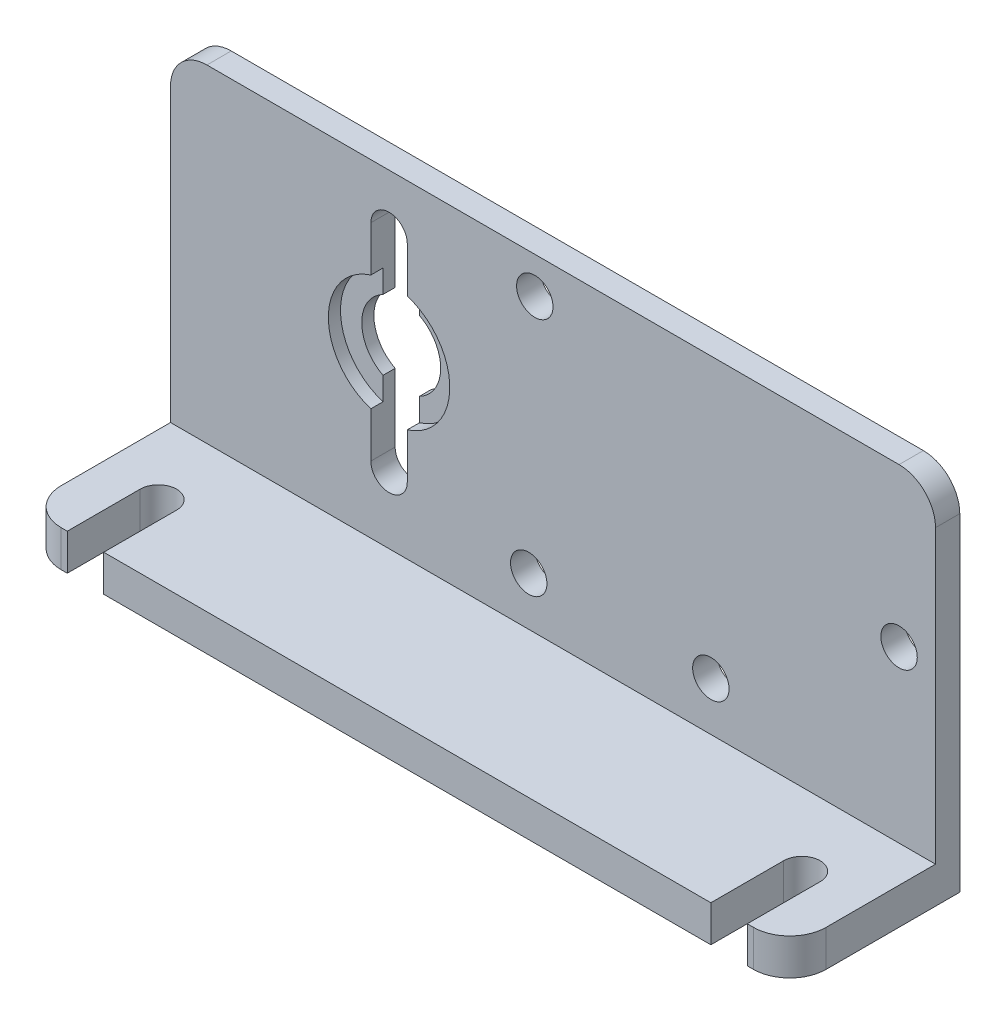
ISO-10303-21;
HEADER;
FILE_DESCRIPTION(('STEP AP214'),'2;1');
FILE_NAME('part.step','',(''),(''),'','','');
FILE_SCHEMA(('AUTOMOTIVE_DESIGN { 1 0 10303 214 1 1 1 1 }'));
ENDSEC;
DATA;
#1=APPLICATION_CONTEXT('core data for automotive mechanical design processes');
#2=APPLICATION_PROTOCOL_DEFINITION('international standard','automotive_design',2000,#1);
#3=PRODUCT_CONTEXT('',#1,'mechanical');
#4=PRODUCT('Part','Part','',(#3));
#5=PRODUCT_RELATED_PRODUCT_CATEGORY('part','',(#4));
#6=PRODUCT_DEFINITION_FORMATION('','',#4);
#7=PRODUCT_DEFINITION_CONTEXT('part definition',#1,'design');
#8=PRODUCT_DEFINITION('design','',#6,#7);
#9=PRODUCT_DEFINITION_SHAPE('','',#8);
#10=(LENGTH_UNIT() NAMED_UNIT(*) SI_UNIT(.MILLI.,.METRE.));
#11=(NAMED_UNIT(*) PLANE_ANGLE_UNIT() SI_UNIT($,.RADIAN.));
#12=(NAMED_UNIT(*) SI_UNIT($,.STERADIAN.) SOLID_ANGLE_UNIT());
#13=UNCERTAINTY_MEASURE_WITH_UNIT(LENGTH_MEASURE(1.E-05),#10,'distance_accuracy_value','');
#14=(GEOMETRIC_REPRESENTATION_CONTEXT(3) GLOBAL_UNCERTAINTY_ASSIGNED_CONTEXT((#13)) GLOBAL_UNIT_ASSIGNED_CONTEXT((#10,
#11,#12)) REPRESENTATION_CONTEXT('',''));
#15=CARTESIAN_POINT('',(0.,0.,0.));
#16=DIRECTION('',(0.,0.,1.));
#17=DIRECTION('',(1.,0.,0.));
#18=AXIS2_PLACEMENT_3D('',#15,#16,#17);
#19=CARTESIAN_POINT('',(-12.,10.5,0.));
#20=DIRECTION('',(1.,0.,0.));
#21=DIRECTION('',(0.,1.,0.));
#22=AXIS2_PLACEMENT_3D('',#19,#20,#21);
#23=PLANE('',#22);
#24=DIRECTION('',(0.,1.,0.));
#25=VECTOR('',#24,1.);
#26=CARTESIAN_POINT('',(-12.,10.5,0.));
#27=LINE('',#26,#25);
#28=CARTESIAN_POINT('',(-12.,4.88314064866771,0.));
#29=VERTEX_POINT('',#28);
#30=CARTESIAN_POINT('',(-12.,10.5,0.));
#31=VERTEX_POINT('',#30);
#32=EDGE_CURVE('E253',#29,#31,#27,.T.);
#33=ORIENTED_EDGE('',*,*,#32,.F.);
#34=DIRECTION('',(0.,0.,1.));
#35=VECTOR('',#34,1.);
#36=CARTESIAN_POINT('',(-12.,4.88314064866771,0.));
#37=LINE('',#36,#35);
#38=CARTESIAN_POINT('',(-12.,4.88314064866771,0.999999999999945));
#39=VERTEX_POINT('',#38);
#40=EDGE_CURVE('E237',#29,#39,#37,.T.);
#41=ORIENTED_EDGE('',*,*,#40,.T.);
#42=DIRECTION('',(0.,-1.,0.));
#43=VECTOR('',#42,1.);
#44=CARTESIAN_POINT('',(-12.,10.5,0.999999999999945));
#45=LINE('',#44,#43);
#46=CARTESIAN_POINT('',(-12.,6.76969600708474,0.999999999999945));
#47=VERTEX_POINT('',#46);
#48=EDGE_CURVE('E529',#47,#39,#45,.T.);
#49=ORIENTED_EDGE('',*,*,#48,.F.);
#50=DIRECTION('',(0.,0.,1.));
#51=VECTOR('',#50,1.);
#52=CARTESIAN_POINT('',(-12.,6.76969600708474,0.999999999999945));
#53=LINE('',#52,#51);
#54=CARTESIAN_POINT('',(-12.,6.76969600708474,1.99999999999995));
#55=VERTEX_POINT('',#54);
#56=EDGE_CURVE('E280',#47,#55,#53,.T.);
#57=ORIENTED_EDGE('',*,*,#56,.T.);
#58=DIRECTION('',(0.,1.,0.));
#59=VECTOR('',#58,1.);
#60=CARTESIAN_POINT('',(-12.,10.5,1.99999999999995));
#61=LINE('',#60,#59);
#62=CARTESIAN_POINT('',(-12.,10.5,1.99999999999995));
#63=VERTEX_POINT('',#62);
#64=EDGE_CURVE('E289',#55,#63,#61,.T.);
#65=ORIENTED_EDGE('',*,*,#64,.T.);
#66=DIRECTION('',(0.,0.,1.));
#67=VECTOR('',#66,1.);
#68=CARTESIAN_POINT('',(-12.,10.5,0.));
#69=LINE('',#68,#67);
#70=EDGE_CURVE('E263',#31,#63,#69,.T.);
#71=ORIENTED_EDGE('',*,*,#70,.F.);
#72=EDGE_LOOP('',(#33,#41,#49,#57,#65,#71));
#73=FACE_BOUND('',#72,.T.);
#74=ADVANCED_FACE('F42',(#73),#23,.F.);
#75=CARTESIAN_POINT('',(-15.,10.5,0.));
#76=DIRECTION('',(-1.,0.,0.));
#77=DIRECTION('',(0.,-1.,0.));
#78=AXIS2_PLACEMENT_3D('',#75,#76,#77);
#79=PLANE('',#78);
#80=DIRECTION('',(0.,-1.,0.));
#81=VECTOR('',#80,1.);
#82=CARTESIAN_POINT('',(-15.,10.5,0.));
#83=LINE('',#82,#81);
#84=CARTESIAN_POINT('',(-15.,-0.88314064866768,0.));
#85=VERTEX_POINT('',#84);
#86=CARTESIAN_POINT('',(-15.,-6.49999999999998,0.));
#87=VERTEX_POINT('',#86);
#88=EDGE_CURVE('E610',#85,#87,#83,.T.);
#89=ORIENTED_EDGE('',*,*,#88,.F.);
#90=DIRECTION('',(0.,0.,1.));
#91=VECTOR('',#90,1.);
#92=CARTESIAN_POINT('',(-15.,-0.88314064866768,0.));
#93=LINE('',#92,#91);
#94=CARTESIAN_POINT('',(-15.,-0.88314064866768,0.999999999999945));
#95=VERTEX_POINT('',#94);
#96=EDGE_CURVE('E552',#85,#95,#93,.T.);
#97=ORIENTED_EDGE('',*,*,#96,.T.);
#98=DIRECTION('',(0.,1.,0.));
#99=VECTOR('',#98,1.);
#100=CARTESIAN_POINT('',(-15.,10.5,0.999999999999945));
#101=LINE('',#100,#99);
#102=CARTESIAN_POINT('',(-15.,-2.76969600708471,0.999999999999945));
#103=VERTEX_POINT('',#102);
#104=EDGE_CURVE('E487',#103,#95,#101,.T.);
#105=ORIENTED_EDGE('',*,*,#104,.F.);
#106=DIRECTION('',(0.,0.,1.));
#107=VECTOR('',#106,1.);
#108=CARTESIAN_POINT('',(-15.,-2.76969600708471,0.999999999999945));
#109=LINE('',#108,#107);
#110=CARTESIAN_POINT('',(-15.,-2.76969600708471,1.99999999999995));
#111=VERTEX_POINT('',#110);
#112=EDGE_CURVE('E51',#103,#111,#109,.T.);
#113=ORIENTED_EDGE('',*,*,#112,.T.);
#114=DIRECTION('',(0.,-1.,0.));
#115=VECTOR('',#114,1.);
#116=CARTESIAN_POINT('',(-15.,10.5,1.99999999999995));
#117=LINE('',#116,#115);
#118=CARTESIAN_POINT('',(-15.,-6.49999999999998,1.99999999999995));
#119=VERTEX_POINT('',#118);
#120=EDGE_CURVE('E279',#111,#119,#117,.T.);
#121=ORIENTED_EDGE('',*,*,#120,.T.);
#122=DIRECTION('',(0.,0.,1.));
#123=VECTOR('',#122,1.);
#124=CARTESIAN_POINT('',(-15.,-6.49999999999998,0.));
#125=LINE('',#124,#123);
#126=EDGE_CURVE('E301',#87,#119,#125,.T.);
#127=ORIENTED_EDGE('',*,*,#126,.F.);
#128=EDGE_LOOP('',(#89,#97,#105,#113,#121,#127));
#129=FACE_BOUND('',#128,.T.);
#130=ADVANCED_FACE('F502',(#129),#79,.F.);
#131=CARTESIAN_POINT('',(0.,0.,14.));
#132=DIRECTION('',(0.,0.,-1.));
#133=DIRECTION('',(-1.,0.,0.));
#134=AXIS2_PLACEMENT_3D('',#131,#132,#133);
#135=PLANE('',#134);
#136=DIRECTION('',(1.,0.,0.));
#137=VECTOR('',#136,1.);
#138=CARTESIAN_POINT('',(-31.5,-15.,14.));
#139=LINE('',#138,#137);
#140=CARTESIAN_POINT('',(-25.,-15.,14.));
#141=VERTEX_POINT('',#140);
#142=CARTESIAN_POINT('',(25.,-15.,13.9999999999999));
#143=VERTEX_POINT('',#142);
#144=EDGE_CURVE('E385',#141,#143,#139,.T.);
#145=ORIENTED_EDGE('',*,*,#144,.T.);
#146=DIRECTION('',(0.,1.,0.));
#147=VECTOR('',#146,1.);
#148=CARTESIAN_POINT('',(25.,-15.,13.9999999999999));
#149=LINE('',#148,#147);
#150=CARTESIAN_POINT('',(25.,-12.,13.9999999999999));
#151=VERTEX_POINT('',#150);
#152=EDGE_CURVE('E333',#143,#151,#149,.T.);
#153=ORIENTED_EDGE('',*,*,#152,.T.);
#154=DIRECTION('',(-1.,0.,0.));
#155=VECTOR('',#154,1.);
#156=CARTESIAN_POINT('',(-31.5,-12.,14.));
#157=LINE('',#156,#155);
#158=CARTESIAN_POINT('',(-25.,-12.,14.));
#159=VERTEX_POINT('',#158);
#160=EDGE_CURVE('E391',#151,#159,#157,.T.);
#161=ORIENTED_EDGE('',*,*,#160,.T.);
#162=DIRECTION('',(0.,1.,0.));
#163=VECTOR('',#162,1.);
#164=CARTESIAN_POINT('',(-25.,-15.,14.));
#165=LINE('',#164,#163);
#166=EDGE_CURVE('E360',#141,#159,#165,.T.);
#167=ORIENTED_EDGE('',*,*,#166,.F.);
#168=EDGE_LOOP('',(#145,#153,#161,#167));
#169=FACE_BOUND('',#168,.T.);
#170=ADVANCED_FACE('F779',(#169),#135,.F.);
#171=CARTESIAN_POINT('',(-28.,-12.,14.));
#172=VERTEX_POINT('',#171);
#173=CARTESIAN_POINT('',(-28.5,-12.,14.));
#174=VERTEX_POINT('',#173);
#175=EDGE_CURVE('E384',#172,#174,#157,.T.);
#176=ORIENTED_EDGE('',*,*,#175,.T.);
#177=DIRECTION('',(0.,-1.,0.));
#178=VECTOR('',#177,1.);
#179=CARTESIAN_POINT('',(-28.5,0.,14.));
#180=LINE('',#179,#178);
#181=CARTESIAN_POINT('',(-28.5,-15.,14.));
#182=VERTEX_POINT('',#181);
#183=EDGE_CURVE('E466',#174,#182,#180,.T.);
#184=ORIENTED_EDGE('',*,*,#183,.T.);
#185=CARTESIAN_POINT('',(-28.,-15.,14.));
#186=VERTEX_POINT('',#185);
#187=EDGE_CURVE('E381',#182,#186,#139,.T.);
#188=ORIENTED_EDGE('',*,*,#187,.T.);
#189=DIRECTION('',(0.,1.,0.));
#190=VECTOR('',#189,1.);
#191=CARTESIAN_POINT('',(-28.,-15.,14.));
#192=LINE('',#191,#190);
#193=EDGE_CURVE('E327',#186,#172,#192,.T.);
#194=ORIENTED_EDGE('',*,*,#193,.T.);
#195=EDGE_LOOP('',(#176,#184,#188,#194));
#196=FACE_BOUND('',#195,.T.);
#197=ADVANCED_FACE('F761',(#196),#135,.F.);
#198=CARTESIAN_POINT('',(0.,0.,2.));
#199=DIRECTION('',(0.,0.,-1.));
#200=DIRECTION('',(-1.,0.,0.));
#201=AXIS2_PLACEMENT_3D('',#198,#199,#200);
#202=PLANE('',#201);
#203=CARTESIAN_POINT('',(28.5,2.,2.));
#204=DIRECTION('',(0.,0.,1.));
#205=DIRECTION('',(1.,0.,0.));
#206=AXIS2_PLACEMENT_3D('',#203,#204,#205);
#207=CIRCLE('',#206,1.5);
#208=CARTESIAN_POINT('',(30.,2.,2.));
#209=VERTEX_POINT('',#208);
#210=EDGE_CURVE('E571',#209,#209,#207,.T.);
#211=ORIENTED_EDGE('',*,*,#210,.F.);
#212=EDGE_LOOP('',(#211));
#213=FACE_BOUND('',#212,.T.);
#214=CARTESIAN_POINT('',(-1.5,12.,2.));
#215=DIRECTION('',(0.,0.,1.));
#216=DIRECTION('',(1.,0.,0.));
#217=AXIS2_PLACEMENT_3D('',#214,#215,#216);
#218=CIRCLE('',#217,1.5);
#219=CARTESIAN_POINT('',(0.,12.,2.));
#220=VERTEX_POINT('',#219);
#221=EDGE_CURVE('E581',#220,#220,#218,.T.);
#222=ORIENTED_EDGE('',*,*,#221,.F.);
#223=EDGE_LOOP('',(#222));
#224=FACE_BOUND('',#223,.T.);
#225=CARTESIAN_POINT('',(-2.,-8.00000000000001,2.));
#226=DIRECTION('',(0.,0.,1.));
#227=DIRECTION('',(1.,0.,0.));
#228=AXIS2_PLACEMENT_3D('',#225,#226,#227);
#229=CIRCLE('',#228,1.5);
#230=CARTESIAN_POINT('',(-0.500000000000002,-8.00000000000001,2.));
#231=VERTEX_POINT('',#230);
#232=EDGE_CURVE('E591',#231,#231,#229,.T.);
#233=ORIENTED_EDGE('',*,*,#232,.F.);
#234=EDGE_LOOP('',(#233));
#235=FACE_BOUND('',#234,.T.);
#236=CARTESIAN_POINT('',(13.,-8.00000000000001,1.99999999999999));
#237=DIRECTION('',(0.,0.,1.));
#238=DIRECTION('',(1.,0.,0.));
#239=AXIS2_PLACEMENT_3D('',#236,#237,#238);
#240=CIRCLE('',#239,1.5);
#241=CARTESIAN_POINT('',(14.5,-8.00000000000001,1.99999999999999));
#242=VERTEX_POINT('',#241);
#243=EDGE_CURVE('E601',#242,#242,#240,.T.);
#244=ORIENTED_EDGE('',*,*,#243,.F.);
#245=EDGE_LOOP('',(#244));
#246=FACE_BOUND('',#245,.T.);
#247=ORIENTED_EDGE('',*,*,#64,.F.);
#248=CARTESIAN_POINT('',(-13.5,2.,1.99999999999995));
#249=DIRECTION('',(0.,0.,1.));
#250=DIRECTION('',(1.,0.,0.));
#251=AXIS2_PLACEMENT_3D('',#248,#249,#250);
#252=CIRCLE('',#251,5.);
#253=CARTESIAN_POINT('',(-12.,-2.76969600708471,1.99999999999995));
#254=VERTEX_POINT('',#253);
#255=EDGE_CURVE('E246',#254,#55,#252,.T.);
#256=ORIENTED_EDGE('',*,*,#255,.F.);
#257=CARTESIAN_POINT('',(-12.,-6.49999999999998,1.99999999999995));
#258=VERTEX_POINT('',#257);
#259=EDGE_CURVE('E290',#258,#254,#61,.T.);
#260=ORIENTED_EDGE('',*,*,#259,.F.);
#261=CARTESIAN_POINT('',(-13.5,-6.49999999999998,1.99999999999995));
#262=DIRECTION('',(0.,0.,1.));
#263=DIRECTION('',(1.,0.,0.));
#264=AXIS2_PLACEMENT_3D('',#261,#262,#263);
#265=CIRCLE('',#264,1.5);
#266=EDGE_CURVE('E285',#119,#258,#265,.T.);
#267=ORIENTED_EDGE('',*,*,#266,.F.);
#268=ORIENTED_EDGE('',*,*,#120,.F.);
#269=CARTESIAN_POINT('',(-15.,6.76969600708474,1.99999999999995));
#270=VERTEX_POINT('',#269);
#271=EDGE_CURVE('E514',#270,#111,#252,.T.);
#272=ORIENTED_EDGE('',*,*,#271,.F.);
#273=CARTESIAN_POINT('',(-15.,10.5,1.99999999999995));
#274=VERTEX_POINT('',#273);
#275=EDGE_CURVE('E281',#274,#270,#117,.T.);
#276=ORIENTED_EDGE('',*,*,#275,.F.);
#277=CARTESIAN_POINT('',(-13.5,10.5,1.99999999999995));
#278=DIRECTION('',(0.,0.,1.));
#279=DIRECTION('',(1.,0.,0.));
#280=AXIS2_PLACEMENT_3D('',#277,#278,#279);
#281=CIRCLE('',#280,1.5);
#282=EDGE_CURVE('E276',#63,#274,#281,.T.);
#283=ORIENTED_EDGE('',*,*,#282,.F.);
#284=EDGE_LOOP('',(#247,#256,#260,#267,#268,#272,#276,#283));
#285=FACE_BOUND('',#284,.T.);
#286=DIRECTION('',(-1.,0.,0.));
#287=VECTOR('',#286,1.);
#288=CARTESIAN_POINT('',(31.5,15.,2.));
#289=LINE('',#288,#287);
#290=CARTESIAN_POINT('',(28.5,15.,2.));
#291=VERTEX_POINT('',#290);
#292=CARTESIAN_POINT('',(-28.5,15.,2.));
#293=VERTEX_POINT('',#292);
#294=EDGE_CURVE('E410',#291,#293,#289,.T.);
#295=ORIENTED_EDGE('',*,*,#294,.T.);
#296=CARTESIAN_POINT('',(-28.5,12.,2.));
#297=DIRECTION('',(0.,0.,-1.));
#298=DIRECTION('',(-1.,0.,0.));
#299=AXIS2_PLACEMENT_3D('',#296,#297,#298);
#300=CIRCLE('',#299,3.);
#301=CARTESIAN_POINT('',(-31.5,12.,2.));
#302=VERTEX_POINT('',#301);
#303=EDGE_CURVE('E457',#293,#302,#300,.F.);
#304=ORIENTED_EDGE('',*,*,#303,.T.);
#305=DIRECTION('',(0.,-1.,0.));
#306=VECTOR('',#305,1.);
#307=CARTESIAN_POINT('',(-31.5,15.,2.));
#308=LINE('',#307,#306);
#309=CARTESIAN_POINT('',(-31.5,-12.,2.));
#310=VERTEX_POINT('',#309);
#311=EDGE_CURVE('E402',#302,#310,#308,.T.);
#312=ORIENTED_EDGE('',*,*,#311,.T.);
#313=DIRECTION('',(-1.,0.,0.));
#314=VECTOR('',#313,1.);
#315=CARTESIAN_POINT('',(-31.5,-12.,2.));
#316=LINE('',#315,#314);
#317=CARTESIAN_POINT('',(31.5,-12.,2.));
#318=VERTEX_POINT('',#317);
#319=EDGE_CURVE('E337',#318,#310,#316,.T.);
#320=ORIENTED_EDGE('',*,*,#319,.F.);
#321=DIRECTION('',(0.,1.,0.));
#322=VECTOR('',#321,1.);
#323=CARTESIAN_POINT('',(31.5,15.,2.));
#324=LINE('',#323,#322);
#325=CARTESIAN_POINT('',(31.5,12.,2.));
#326=VERTEX_POINT('',#325);
#327=EDGE_CURVE('E405',#318,#326,#324,.T.);
#328=ORIENTED_EDGE('',*,*,#327,.T.);
#329=CARTESIAN_POINT('',(28.5,12.,2.));
#330=DIRECTION('',(0.,0.,-1.));
#331=DIRECTION('',(-1.,0.,0.));
#332=AXIS2_PLACEMENT_3D('',#329,#330,#331);
#333=CIRCLE('',#332,3.);
#334=EDGE_CURVE('E454',#326,#291,#333,.F.);
#335=ORIENTED_EDGE('',*,*,#334,.T.);
#336=EDGE_LOOP('',(#295,#304,#312,#320,#328,#335));
#337=FACE_BOUND('',#336,.T.);
#338=ADVANCED_FACE('F511',(#213,#224,#235,#246,#285,#337),#202,.F.);
#339=CARTESIAN_POINT('',(-31.5,15.,2.));
#340=DIRECTION('',(1.,0.,0.));
#341=DIRECTION('',(0.,0.,-1.));
#342=AXIS2_PLACEMENT_3D('',#339,#340,#341);
#343=PLANE('',#342);
#344=ORIENTED_EDGE('',*,*,#311,.F.);
#345=DIRECTION('',(0.,0.,-1.));
#346=VECTOR('',#345,1.);
#347=CARTESIAN_POINT('',(-31.5,12.,2.));
#348=LINE('',#347,#346);
#349=CARTESIAN_POINT('',(-31.5,12.,0.));
#350=VERTEX_POINT('',#349);
#351=EDGE_CURVE('E437',#302,#350,#348,.T.);
#352=ORIENTED_EDGE('',*,*,#351,.T.);
#353=DIRECTION('',(0.,-1.,0.));
#354=VECTOR('',#353,1.);
#355=CARTESIAN_POINT('',(-31.5,15.,0.));
#356=LINE('',#355,#354);
#357=CARTESIAN_POINT('',(-31.5,-15.,0.));
#358=VERTEX_POINT('',#357);
#359=EDGE_CURVE('E401',#350,#358,#356,.T.);
#360=ORIENTED_EDGE('',*,*,#359,.T.);
#361=DIRECTION('',(0.,0.,-1.));
#362=VECTOR('',#361,1.);
#363=CARTESIAN_POINT('',(-31.5,-15.,2.));
#364=LINE('',#363,#362);
#365=CARTESIAN_POINT('',(-31.5,-15.,11.));
#366=VERTEX_POINT('',#365);
#367=EDGE_CURVE('E431',#366,#358,#364,.T.);
#368=ORIENTED_EDGE('',*,*,#367,.F.);
#369=DIRECTION('',(0.,-1.,0.));
#370=VECTOR('',#369,1.);
#371=CARTESIAN_POINT('',(-31.5,15.,11.));
#372=LINE('',#371,#370);
#373=CARTESIAN_POINT('',(-31.5,-12.,11.));
#374=VERTEX_POINT('',#373);
#375=EDGE_CURVE('E434',#366,#374,#372,.F.);
#376=ORIENTED_EDGE('',*,*,#375,.T.);
#377=DIRECTION('',(0.,0.,-1.));
#378=VECTOR('',#377,1.);
#379=CARTESIAN_POINT('',(-31.5,-12.,14.));
#380=LINE('',#379,#378);
#381=EDGE_CURVE('E390',#374,#310,#380,.T.);
#382=ORIENTED_EDGE('',*,*,#381,.T.);
#383=EDGE_LOOP('',(#344,#352,#360,#368,#376,#382));
#384=FACE_BOUND('',#383,.T.);
#385=ADVANCED_FACE('F751',(#384),#343,.F.);
#386=CARTESIAN_POINT('',(31.5,-15.,2.));
#387=DIRECTION('',(0.,1.,0.));
#388=DIRECTION('',(-1.,0.,0.));
#389=AXIS2_PLACEMENT_3D('',#386,#387,#388);
#390=PLANE('',#389);
#391=ORIENTED_EDGE('',*,*,#187,.F.);
#392=CARTESIAN_POINT('',(-28.5,-15.,11.));
#393=DIRECTION('',(0.,1.,0.));
#394=DIRECTION('',(-1.,0.,0.));
#395=AXIS2_PLACEMENT_3D('',#392,#393,#394);
#396=CIRCLE('',#395,3.);
#397=EDGE_CURVE('E473',#182,#366,#396,.F.);
#398=ORIENTED_EDGE('',*,*,#397,.T.);
#399=ORIENTED_EDGE('',*,*,#367,.T.);
#400=DIRECTION('',(1.,0.,0.));
#401=VECTOR('',#400,1.);
#402=CARTESIAN_POINT('',(31.5,-15.,0.));
#403=LINE('',#402,#401);
#404=CARTESIAN_POINT('',(31.5,-15.,0.));
#405=VERTEX_POINT('',#404);
#406=EDGE_CURVE('E418',#358,#405,#403,.T.);
#407=ORIENTED_EDGE('',*,*,#406,.T.);
#408=DIRECTION('',(0.,0.,-1.));
#409=VECTOR('',#408,1.);
#410=CARTESIAN_POINT('',(31.5,-15.,2.));
#411=LINE('',#410,#409);
#412=CARTESIAN_POINT('',(31.5,-15.,11.));
#413=VERTEX_POINT('',#412);
#414=EDGE_CURVE('E414',#413,#405,#411,.T.);
#415=ORIENTED_EDGE('',*,*,#414,.F.);
#416=CARTESIAN_POINT('',(28.5,-15.,11.));
#417=DIRECTION('',(0.,1.,0.));
#418=DIRECTION('',(-1.,0.,0.));
#419=AXIS2_PLACEMENT_3D('',#416,#417,#418);
#420=CIRCLE('',#419,3.);
#421=CARTESIAN_POINT('',(28.5,-15.,14.));
#422=VERTEX_POINT('',#421);
#423=EDGE_CURVE('E470',#413,#422,#420,.F.);
#424=ORIENTED_EDGE('',*,*,#423,.T.);
#425=CARTESIAN_POINT('',(28.,-15.,14.));
#426=VERTEX_POINT('',#425);
#427=EDGE_CURVE('E386',#426,#422,#139,.T.);
#428=ORIENTED_EDGE('',*,*,#427,.F.);
#429=DIRECTION('',(0.,0.,-1.));
#430=VECTOR('',#429,1.);
#431=CARTESIAN_POINT('',(28.,-15.,14.));
#432=LINE('',#431,#430);
#433=CARTESIAN_POINT('',(28.,-15.,7.99999999999999));
#434=VERTEX_POINT('',#433);
#435=EDGE_CURVE('E308',#426,#434,#432,.T.);
#436=ORIENTED_EDGE('',*,*,#435,.T.);
#437=CARTESIAN_POINT('',(26.5,-15.,7.99999999999999));
#438=DIRECTION('',(0.,1.,0.));
#439=DIRECTION('',(0.,0.,1.));
#440=AXIS2_PLACEMENT_3D('',#437,#438,#439);
#441=CIRCLE('',#440,1.49999999999999);
#442=CARTESIAN_POINT('',(25.,-15.,7.99999999999995));
#443=VERTEX_POINT('',#442);
#444=EDGE_CURVE('E312',#434,#443,#441,.T.);
#445=ORIENTED_EDGE('',*,*,#444,.T.);
#446=DIRECTION('',(0.,0.,1.));
#447=VECTOR('',#446,1.);
#448=CARTESIAN_POINT('',(25.,-15.,13.9999999999999));
#449=LINE('',#448,#447);
#450=EDGE_CURVE('E317',#443,#143,#449,.T.);
#451=ORIENTED_EDGE('',*,*,#450,.T.);
#452=ORIENTED_EDGE('',*,*,#144,.F.);
#453=DIRECTION('',(0.,0.,-1.));
#454=VECTOR('',#453,1.);
#455=CARTESIAN_POINT('',(-25.,-15.,14.));
#456=LINE('',#455,#454);
#457=CARTESIAN_POINT('',(-25.,-15.,8.00000000000001));
#458=VERTEX_POINT('',#457);
#459=EDGE_CURVE('E347',#141,#458,#456,.T.);
#460=ORIENTED_EDGE('',*,*,#459,.T.);
#461=CARTESIAN_POINT('',(-26.5,-15.,7.99999999999999));
#462=DIRECTION('',(0.,1.,0.));
#463=DIRECTION('',(0.,0.,-1.));
#464=AXIS2_PLACEMENT_3D('',#461,#462,#463);
#465=CIRCLE('',#464,1.49999999999999);
#466=CARTESIAN_POINT('',(-28.,-15.,8.00000000000001));
#467=VERTEX_POINT('',#466);
#468=EDGE_CURVE('E351',#458,#467,#465,.T.);
#469=ORIENTED_EDGE('',*,*,#468,.T.);
#470=DIRECTION('',(0.,0.,1.));
#471=VECTOR('',#470,1.);
#472=CARTESIAN_POINT('',(-28.,-15.,14.));
#473=LINE('',#472,#471);
#474=EDGE_CURVE('E356',#467,#186,#473,.T.);
#475=ORIENTED_EDGE('',*,*,#474,.T.);
#476=EDGE_LOOP('',(#391,#398,#399,#407,#415,#424,#428,#436,#445,#451,#452,#460,#469,#475));
#477=FACE_BOUND('',#476,.T.);
#478=ADVANCED_FACE('F763',(#477),#390,.F.);
#479=CARTESIAN_POINT('',(31.5,15.,2.));
#480=DIRECTION('',(-1.,0.,0.));
#481=DIRECTION('',(0.,0.,1.));
#482=AXIS2_PLACEMENT_3D('',#479,#480,#481);
#483=PLANE('',#482);
#484=DIRECTION('',(0.,1.,0.));
#485=VECTOR('',#484,1.);
#486=CARTESIAN_POINT('',(31.5,15.,0.));
#487=LINE('',#486,#485);
#488=CARTESIAN_POINT('',(31.5,12.,0.));
#489=VERTEX_POINT('',#488);
#490=EDGE_CURVE('E422',#405,#489,#487,.T.);
#491=ORIENTED_EDGE('',*,*,#490,.T.);
#492=DIRECTION('',(0.,0.,-1.));
#493=VECTOR('',#492,1.);
#494=CARTESIAN_POINT('',(31.5,12.,2.));
#495=LINE('',#494,#493);
#496=EDGE_CURVE('E463',#489,#326,#495,.F.);
#497=ORIENTED_EDGE('',*,*,#496,.T.);
#498=ORIENTED_EDGE('',*,*,#327,.F.);
#499=DIRECTION('',(0.,0.,-1.));
#500=VECTOR('',#499,1.);
#501=CARTESIAN_POINT('',(31.5,-12.,14.));
#502=LINE('',#501,#500);
#503=CARTESIAN_POINT('',(31.5,-12.,11.));
#504=VERTEX_POINT('',#503);
#505=EDGE_CURVE('E398',#504,#318,#502,.T.);
#506=ORIENTED_EDGE('',*,*,#505,.F.);
#507=DIRECTION('',(0.,1.,0.));
#508=VECTOR('',#507,1.);
#509=CARTESIAN_POINT('',(31.5,15.,11.));
#510=LINE('',#509,#508);
#511=EDGE_CURVE('E460',#504,#413,#510,.F.);
#512=ORIENTED_EDGE('',*,*,#511,.T.);
#513=ORIENTED_EDGE('',*,*,#414,.T.);
#514=EDGE_LOOP('',(#491,#497,#498,#506,#512,#513));
#515=FACE_BOUND('',#514,.T.);
#516=ADVANCED_FACE('F730',(#515),#483,.F.);
#517=CARTESIAN_POINT('',(31.5,15.,2.));
#518=DIRECTION('',(0.,-1.,0.));
#519=DIRECTION('',(1.,0.,0.));
#520=AXIS2_PLACEMENT_3D('',#517,#518,#519);
#521=PLANE('',#520);
#522=DIRECTION('',(-1.,0.,0.));
#523=VECTOR('',#522,1.);
#524=CARTESIAN_POINT('',(31.5,15.,0.));
#525=LINE('',#524,#523);
#526=CARTESIAN_POINT('',(28.5,15.,0.));
#527=VERTEX_POINT('',#526);
#528=CARTESIAN_POINT('',(-28.5,15.,0.));
#529=VERTEX_POINT('',#528);
#530=EDGE_CURVE('E406',#527,#529,#525,.T.);
#531=ORIENTED_EDGE('',*,*,#530,.T.);
#532=DIRECTION('',(0.,0.,-1.));
#533=VECTOR('',#532,1.);
#534=CARTESIAN_POINT('',(-28.5,15.,2.));
#535=LINE('',#534,#533);
#536=EDGE_CURVE('E451',#529,#293,#535,.F.);
#537=ORIENTED_EDGE('',*,*,#536,.T.);
#538=ORIENTED_EDGE('',*,*,#294,.F.);
#539=DIRECTION('',(0.,0.,-1.));
#540=VECTOR('',#539,1.);
#541=CARTESIAN_POINT('',(28.5,15.,2.));
#542=LINE('',#541,#540);
#543=EDGE_CURVE('E447',#291,#527,#542,.T.);
#544=ORIENTED_EDGE('',*,*,#543,.T.);
#545=EDGE_LOOP('',(#531,#537,#538,#544));
#546=FACE_BOUND('',#545,.T.);
#547=ADVANCED_FACE('F740',(#546),#521,.F.);
#548=CARTESIAN_POINT('',(0.,0.,0.));
#549=DIRECTION('',(0.,0.,-1.));
#550=DIRECTION('',(-1.,0.,0.));
#551=AXIS2_PLACEMENT_3D('',#548,#549,#550);
#552=PLANE('',#551);
#553=CARTESIAN_POINT('',(28.5,2.,0.));
#554=DIRECTION('',(0.,0.,1.));
#555=DIRECTION('',(1.,0.,0.));
#556=AXIS2_PLACEMENT_3D('',#553,#554,#555);
#557=CIRCLE('',#556,1.5);
#558=CARTESIAN_POINT('',(30.,2.,0.));
#559=VERTEX_POINT('',#558);
#560=EDGE_CURVE('E566',#559,#559,#557,.T.);
#561=ORIENTED_EDGE('',*,*,#560,.T.);
#562=EDGE_LOOP('',(#561));
#563=FACE_BOUND('',#562,.T.);
#564=CARTESIAN_POINT('',(-1.5,12.,0.));
#565=DIRECTION('',(0.,0.,1.));
#566=DIRECTION('',(1.,0.,0.));
#567=AXIS2_PLACEMENT_3D('',#564,#565,#566);
#568=CIRCLE('',#567,1.5);
#569=CARTESIAN_POINT('',(0.,12.,0.));
#570=VERTEX_POINT('',#569);
#571=EDGE_CURVE('E576',#570,#570,#568,.T.);
#572=ORIENTED_EDGE('',*,*,#571,.T.);
#573=EDGE_LOOP('',(#572));
#574=FACE_BOUND('',#573,.T.);
#575=CARTESIAN_POINT('',(-2.,-8.00000000000001,0.));
#576=DIRECTION('',(0.,0.,1.));
#577=DIRECTION('',(1.,0.,0.));
#578=AXIS2_PLACEMENT_3D('',#575,#576,#577);
#579=CIRCLE('',#578,1.5);
#580=CARTESIAN_POINT('',(-0.500000000000002,-8.00000000000001,0.));
#581=VERTEX_POINT('',#580);
#582=EDGE_CURVE('E586',#581,#581,#579,.T.);
#583=ORIENTED_EDGE('',*,*,#582,.T.);
#584=EDGE_LOOP('',(#583));
#585=FACE_BOUND('',#584,.T.);
#586=CARTESIAN_POINT('',(13.,-8.00000000000001,0.));
#587=DIRECTION('',(0.,0.,1.));
#588=DIRECTION('',(1.,0.,0.));
#589=AXIS2_PLACEMENT_3D('',#586,#587,#588);
#590=CIRCLE('',#589,1.5);
#591=CARTESIAN_POINT('',(14.5,-8.00000000000001,0.));
#592=VERTEX_POINT('',#591);
#593=EDGE_CURVE('E596',#592,#592,#590,.T.);
#594=ORIENTED_EDGE('',*,*,#593,.T.);
#595=EDGE_LOOP('',(#594));
#596=FACE_BOUND('',#595,.T.);
#597=CARTESIAN_POINT('',(-13.5,2.,0.));
#598=DIRECTION('',(0.,0.,1.));
#599=DIRECTION('',(1.,0.,0.));
#600=AXIS2_PLACEMENT_3D('',#597,#598,#599);
#601=CIRCLE('',#600,3.25);
#602=CARTESIAN_POINT('',(-12.,-0.88314064866768,0.));
#603=VERTEX_POINT('',#602);
#604=EDGE_CURVE('E240',#603,#29,#601,.T.);
#605=ORIENTED_EDGE('',*,*,#604,.T.);
#606=ORIENTED_EDGE('',*,*,#32,.T.);
#607=CARTESIAN_POINT('',(-13.5,10.5,0.));
#608=DIRECTION('',(0.,0.,1.));
#609=DIRECTION('',(1.,0.,0.));
#610=AXIS2_PLACEMENT_3D('',#607,#608,#609);
#611=CIRCLE('',#610,1.5);
#612=CARTESIAN_POINT('',(-15.,10.5,0.));
#613=VERTEX_POINT('',#612);
#614=EDGE_CURVE('E294',#31,#613,#611,.T.);
#615=ORIENTED_EDGE('',*,*,#614,.T.);
#616=CARTESIAN_POINT('',(-15.,4.88314064866771,0.));
#617=VERTEX_POINT('',#616);
#618=EDGE_CURVE('E272',#613,#617,#83,.T.);
#619=ORIENTED_EDGE('',*,*,#618,.T.);
#620=EDGE_CURVE('E259',#617,#85,#601,.T.);
#621=ORIENTED_EDGE('',*,*,#620,.T.);
#622=ORIENTED_EDGE('',*,*,#88,.T.);
#623=CARTESIAN_POINT('',(-13.5,-6.49999999999998,0.));
#624=DIRECTION('',(0.,0.,1.));
#625=DIRECTION('',(1.,0.,0.));
#626=AXIS2_PLACEMENT_3D('',#623,#624,#625);
#627=CIRCLE('',#626,1.5);
#628=CARTESIAN_POINT('',(-12.,-6.49999999999998,0.));
#629=VERTEX_POINT('',#628);
#630=EDGE_CURVE('E266',#87,#629,#627,.T.);
#631=ORIENTED_EDGE('',*,*,#630,.T.);
#632=EDGE_CURVE('E257',#629,#603,#27,.T.);
#633=ORIENTED_EDGE('',*,*,#632,.T.);
#634=EDGE_LOOP('',(#605,#606,#615,#619,#621,#622,#631,#633));
#635=FACE_BOUND('',#634,.T.);
#636=ORIENTED_EDGE('',*,*,#359,.F.);
#637=CARTESIAN_POINT('',(-28.5,12.,0.));
#638=DIRECTION('',(0.,0.,-1.));
#639=DIRECTION('',(-1.,0.,0.));
#640=AXIS2_PLACEMENT_3D('',#637,#638,#639);
#641=CIRCLE('',#640,3.);
#642=EDGE_CURVE('E444',#350,#529,#641,.T.);
#643=ORIENTED_EDGE('',*,*,#642,.T.);
#644=ORIENTED_EDGE('',*,*,#530,.F.);
#645=CARTESIAN_POINT('',(28.5,12.,0.));
#646=DIRECTION('',(0.,0.,-1.));
#647=DIRECTION('',(-1.,0.,0.));
#648=AXIS2_PLACEMENT_3D('',#645,#646,#647);
#649=CIRCLE('',#648,3.);
#650=EDGE_CURVE('E441',#527,#489,#649,.T.);
#651=ORIENTED_EDGE('',*,*,#650,.T.);
#652=ORIENTED_EDGE('',*,*,#490,.F.);
#653=ORIENTED_EDGE('',*,*,#406,.F.);
#654=EDGE_LOOP('',(#636,#643,#644,#651,#652,#653));
#655=FACE_BOUND('',#654,.T.);
#656=ADVANCED_FACE('F250',(#563,#574,#585,#596,#635,#655),#552,.T.);
#657=CARTESIAN_POINT('',(-31.5,-12.,14.));
#658=DIRECTION('',(0.,-1.,0.));
#659=DIRECTION('',(0.,0.,-1.));
#660=AXIS2_PLACEMENT_3D('',#657,#658,#659);
#661=PLANE('',#660);
#662=ORIENTED_EDGE('',*,*,#381,.F.);
#663=CARTESIAN_POINT('',(-28.5,-12.,11.));
#664=DIRECTION('',(0.,-1.,0.));
#665=DIRECTION('',(0.,0.,-1.));
#666=AXIS2_PLACEMENT_3D('',#663,#664,#665);
#667=CIRCLE('',#666,3.);
#668=EDGE_CURVE('E479',#374,#174,#667,.F.);
#669=ORIENTED_EDGE('',*,*,#668,.T.);
#670=ORIENTED_EDGE('',*,*,#175,.F.);
#671=DIRECTION('',(0.,0.,1.));
#672=VECTOR('',#671,1.);
#673=CARTESIAN_POINT('',(-28.,-12.,14.));
#674=LINE('',#673,#672);
#675=CARTESIAN_POINT('',(-28.,-12.,8.00000000000001));
#676=VERTEX_POINT('',#675);
#677=EDGE_CURVE('E352',#676,#172,#674,.T.);
#678=ORIENTED_EDGE('',*,*,#677,.F.);
#679=CARTESIAN_POINT('',(-26.5,-12.,7.99999999999999));
#680=DIRECTION('',(0.,1.,0.));
#681=DIRECTION('',(0.,0.,-1.));
#682=AXIS2_PLACEMENT_3D('',#679,#680,#681);
#683=CIRCLE('',#682,1.49999999999999);
#684=CARTESIAN_POINT('',(-25.,-12.,8.00000000000001));
#685=VERTEX_POINT('',#684);
#686=EDGE_CURVE('E364',#685,#676,#683,.T.);
#687=ORIENTED_EDGE('',*,*,#686,.F.);
#688=DIRECTION('',(0.,0.,-1.));
#689=VECTOR('',#688,1.);
#690=CARTESIAN_POINT('',(-25.,-12.,14.));
#691=LINE('',#690,#689);
#692=EDGE_CURVE('E297',#159,#685,#691,.T.);
#693=ORIENTED_EDGE('',*,*,#692,.F.);
#694=ORIENTED_EDGE('',*,*,#160,.F.);
#695=DIRECTION('',(0.,0.,1.));
#696=VECTOR('',#695,1.);
#697=CARTESIAN_POINT('',(25.,-12.,13.9999999999999));
#698=LINE('',#697,#696);
#699=CARTESIAN_POINT('',(25.,-12.,7.99999999999995));
#700=VERTEX_POINT('',#699);
#701=EDGE_CURVE('E313',#700,#151,#698,.T.);
#702=ORIENTED_EDGE('',*,*,#701,.F.);
#703=CARTESIAN_POINT('',(26.5,-12.,7.99999999999999));
#704=DIRECTION('',(0.,1.,0.));
#705=DIRECTION('',(0.,0.,1.));
#706=AXIS2_PLACEMENT_3D('',#703,#704,#705);
#707=CIRCLE('',#706,1.49999999999999);
#708=CARTESIAN_POINT('',(28.,-12.,7.99999999999999));
#709=VERTEX_POINT('',#708);
#710=EDGE_CURVE('E326',#709,#700,#707,.T.);
#711=ORIENTED_EDGE('',*,*,#710,.F.);
#712=DIRECTION('',(0.,0.,-1.));
#713=VECTOR('',#712,1.);
#714=CARTESIAN_POINT('',(28.,-12.,14.));
#715=LINE('',#714,#713);
#716=CARTESIAN_POINT('',(28.,-12.,14.));
#717=VERTEX_POINT('',#716);
#718=EDGE_CURVE('E322',#717,#709,#715,.T.);
#719=ORIENTED_EDGE('',*,*,#718,.F.);
#720=CARTESIAN_POINT('',(28.5,-12.,14.));
#721=VERTEX_POINT('',#720);
#722=EDGE_CURVE('E387',#721,#717,#157,.T.);
#723=ORIENTED_EDGE('',*,*,#722,.F.);
#724=CARTESIAN_POINT('',(28.5,-12.,11.));
#725=DIRECTION('',(0.,-1.,0.));
#726=DIRECTION('',(0.,0.,-1.));
#727=AXIS2_PLACEMENT_3D('',#724,#725,#726);
#728=CIRCLE('',#727,3.);
#729=EDGE_CURVE('E476',#721,#504,#728,.F.);
#730=ORIENTED_EDGE('',*,*,#729,.T.);
#731=ORIENTED_EDGE('',*,*,#505,.T.);
#732=ORIENTED_EDGE('',*,*,#319,.T.);
#733=EDGE_LOOP('',(#662,#669,#670,#678,#687,#693,#694,#702,#711,#719,#723,#730,#731,#732));
#734=FACE_BOUND('',#733,.T.);
#735=ADVANCED_FACE('F725',(#734),#661,.F.);
#736=ORIENTED_EDGE('',*,*,#427,.T.);
#737=DIRECTION('',(0.,1.,0.));
#738=VECTOR('',#737,1.);
#739=CARTESIAN_POINT('',(28.5,0.,14.));
#740=LINE('',#739,#738);
#741=EDGE_CURVE('E482',#422,#721,#740,.T.);
#742=ORIENTED_EDGE('',*,*,#741,.T.);
#743=ORIENTED_EDGE('',*,*,#722,.T.);
#744=DIRECTION('',(0.,1.,0.));
#745=VECTOR('',#744,1.);
#746=CARTESIAN_POINT('',(28.,-15.,14.));
#747=LINE('',#746,#745);
#748=EDGE_CURVE('E321',#426,#717,#747,.T.);
#749=ORIENTED_EDGE('',*,*,#748,.F.);
#750=EDGE_LOOP('',(#736,#742,#743,#749));
#751=FACE_BOUND('',#750,.T.);
#752=ADVANCED_FACE('F716',(#751),#135,.F.);
#753=CARTESIAN_POINT('',(-28.,-15.,14.));
#754=DIRECTION('',(-1.,0.,0.));
#755=DIRECTION('',(0.,0.,1.));
#756=AXIS2_PLACEMENT_3D('',#753,#754,#755);
#757=PLANE('',#756);
#758=ORIENTED_EDGE('',*,*,#677,.T.);
#759=ORIENTED_EDGE('',*,*,#193,.F.);
#760=ORIENTED_EDGE('',*,*,#474,.F.);
#761=DIRECTION('',(0.,1.,0.));
#762=VECTOR('',#761,1.);
#763=CARTESIAN_POINT('',(-28.,-15.,8.00000000000001));
#764=LINE('',#763,#762);
#765=EDGE_CURVE('E373',#467,#676,#764,.T.);
#766=ORIENTED_EDGE('',*,*,#765,.T.);
#767=EDGE_LOOP('',(#758,#759,#760,#766));
#768=FACE_BOUND('',#767,.T.);
#769=ADVANCED_FACE('F767',(#768),#757,.F.);
#770=CARTESIAN_POINT('',(-26.5,-15.,7.99999999999999));
#771=DIRECTION('',(0.,1.,0.));
#772=DIRECTION('',(0.,0.,1.));
#773=AXIS2_PLACEMENT_3D('',#770,#771,#772);
#774=CYLINDRICAL_SURFACE('',#773,1.49999999999999);
#775=ORIENTED_EDGE('',*,*,#686,.T.);
#776=ORIENTED_EDGE('',*,*,#765,.F.);
#777=ORIENTED_EDGE('',*,*,#468,.F.);
#778=DIRECTION('',(0.,1.,0.));
#779=VECTOR('',#778,1.);
#780=CARTESIAN_POINT('',(-25.,-15.,8.00000000000001));
#781=LINE('',#780,#779);
#782=EDGE_CURVE('E376',#458,#685,#781,.T.);
#783=ORIENTED_EDGE('',*,*,#782,.T.);
#784=EDGE_LOOP('',(#775,#776,#777,#783));
#785=FACE_BOUND('',#784,.T.);
#786=ADVANCED_FACE('F773',(#785),#774,.F.);
#787=CARTESIAN_POINT('',(-25.,-15.,14.));
#788=DIRECTION('',(1.,0.,0.));
#789=DIRECTION('',(0.,0.,-1.));
#790=AXIS2_PLACEMENT_3D('',#787,#788,#789);
#791=PLANE('',#790);
#792=ORIENTED_EDGE('',*,*,#692,.T.);
#793=ORIENTED_EDGE('',*,*,#782,.F.);
#794=ORIENTED_EDGE('',*,*,#459,.F.);
#795=ORIENTED_EDGE('',*,*,#166,.T.);
#796=EDGE_LOOP('',(#792,#793,#794,#795));
#797=FACE_BOUND('',#796,.T.);
#798=ADVANCED_FACE('F775',(#797),#791,.F.);
#799=CARTESIAN_POINT('',(25.,-15.,13.9999999999999));
#800=DIRECTION('',(-1.,0.,0.));
#801=DIRECTION('',(0.,0.,1.));
#802=AXIS2_PLACEMENT_3D('',#799,#800,#801);
#803=PLANE('',#802);
#804=ORIENTED_EDGE('',*,*,#701,.T.);
#805=ORIENTED_EDGE('',*,*,#152,.F.);
#806=ORIENTED_EDGE('',*,*,#450,.F.);
#807=DIRECTION('',(0.,1.,0.));
#808=VECTOR('',#807,1.);
#809=CARTESIAN_POINT('',(25.,-15.,7.99999999999995));
#810=LINE('',#809,#808);
#811=EDGE_CURVE('E338',#443,#700,#810,.T.);
#812=ORIENTED_EDGE('',*,*,#811,.T.);
#813=EDGE_LOOP('',(#804,#805,#806,#812));
#814=FACE_BOUND('',#813,.T.);
#815=ADVANCED_FACE('F783',(#814),#803,.F.);
#816=CARTESIAN_POINT('',(26.5,-15.,7.99999999999999));
#817=DIRECTION('',(0.,1.,0.));
#818=DIRECTION('',(0.,0.,1.));
#819=AXIS2_PLACEMENT_3D('',#816,#817,#818);
#820=CYLINDRICAL_SURFACE('',#819,1.49999999999999);
#821=ORIENTED_EDGE('',*,*,#710,.T.);
#822=ORIENTED_EDGE('',*,*,#811,.F.);
#823=ORIENTED_EDGE('',*,*,#444,.F.);
#824=DIRECTION('',(0.,1.,0.));
#825=VECTOR('',#824,1.);
#826=CARTESIAN_POINT('',(28.,-15.,7.99999999999999));
#827=LINE('',#826,#825);
#828=EDGE_CURVE('E341',#434,#709,#827,.T.);
#829=ORIENTED_EDGE('',*,*,#828,.T.);
#830=EDGE_LOOP('',(#821,#822,#823,#829));
#831=FACE_BOUND('',#830,.T.);
#832=ADVANCED_FACE('F787',(#831),#820,.F.);
#833=CARTESIAN_POINT('',(28.,-15.,14.));
#834=DIRECTION('',(1.,0.,0.));
#835=DIRECTION('',(0.,0.,-1.));
#836=AXIS2_PLACEMENT_3D('',#833,#834,#835);
#837=PLANE('',#836);
#838=ORIENTED_EDGE('',*,*,#718,.T.);
#839=ORIENTED_EDGE('',*,*,#828,.F.);
#840=ORIENTED_EDGE('',*,*,#435,.F.);
#841=ORIENTED_EDGE('',*,*,#748,.T.);
#842=EDGE_LOOP('',(#838,#839,#840,#841));
#843=FACE_BOUND('',#842,.T.);
#844=ADVANCED_FACE('F789',(#843),#837,.F.);
#845=CARTESIAN_POINT('',(-28.5,12.,2.));
#846=DIRECTION('',(0.,0.,-1.));
#847=DIRECTION('',(-1.,0.,0.));
#848=AXIS2_PLACEMENT_3D('',#845,#846,#847);
#849=CYLINDRICAL_SURFACE('',#848,3.);
#850=ORIENTED_EDGE('',*,*,#303,.F.);
#851=ORIENTED_EDGE('',*,*,#536,.F.);
#852=ORIENTED_EDGE('',*,*,#642,.F.);
#853=ORIENTED_EDGE('',*,*,#351,.F.);
#854=EDGE_LOOP('',(#850,#851,#852,#853));
#855=FACE_BOUND('',#854,.T.);
#856=ADVANCED_FACE('F748',(#855),#849,.T.);
#857=CARTESIAN_POINT('',(28.5,12.,2.));
#858=DIRECTION('',(0.,0.,-1.));
#859=DIRECTION('',(-1.,0.,0.));
#860=AXIS2_PLACEMENT_3D('',#857,#858,#859);
#861=CYLINDRICAL_SURFACE('',#860,3.);
#862=ORIENTED_EDGE('',*,*,#334,.F.);
#863=ORIENTED_EDGE('',*,*,#496,.F.);
#864=ORIENTED_EDGE('',*,*,#650,.F.);
#865=ORIENTED_EDGE('',*,*,#543,.F.);
#866=EDGE_LOOP('',(#862,#863,#864,#865));
#867=FACE_BOUND('',#866,.T.);
#868=ADVANCED_FACE('F737',(#867),#861,.T.);
#869=CARTESIAN_POINT('',(-28.5,0.,11.));
#870=DIRECTION('',(0.,-1.,0.));
#871=DIRECTION('',(0.,0.,-1.));
#872=AXIS2_PLACEMENT_3D('',#869,#870,#871);
#873=CYLINDRICAL_SURFACE('',#872,3.);
#874=ORIENTED_EDGE('',*,*,#668,.F.);
#875=ORIENTED_EDGE('',*,*,#375,.F.);
#876=ORIENTED_EDGE('',*,*,#397,.F.);
#877=ORIENTED_EDGE('',*,*,#183,.F.);
#878=EDGE_LOOP('',(#874,#875,#876,#877));
#879=FACE_BOUND('',#878,.T.);
#880=ADVANCED_FACE('F758',(#879),#873,.T.);
#881=CARTESIAN_POINT('',(28.5,0.,11.));
#882=DIRECTION('',(0.,1.,0.));
#883=DIRECTION('',(0.,0.,1.));
#884=AXIS2_PLACEMENT_3D('',#881,#882,#883);
#885=CYLINDRICAL_SURFACE('',#884,3.);
#886=ORIENTED_EDGE('',*,*,#423,.F.);
#887=ORIENTED_EDGE('',*,*,#511,.F.);
#888=ORIENTED_EDGE('',*,*,#729,.F.);
#889=ORIENTED_EDGE('',*,*,#741,.F.);
#890=EDGE_LOOP('',(#886,#887,#888,#889));
#891=FACE_BOUND('',#890,.T.);
#892=ADVANCED_FACE('F44',(#891),#885,.T.);
#893=CARTESIAN_POINT('',(-13.5,10.5,0.));
#894=DIRECTION('',(0.,0.,1.));
#895=DIRECTION('',(1.,0.,0.));
#896=AXIS2_PLACEMENT_3D('',#893,#894,#895);
#897=CYLINDRICAL_SURFACE('',#896,1.5);
#898=ORIENTED_EDGE('',*,*,#282,.T.);
#899=DIRECTION('',(0.,0.,1.));
#900=VECTOR('',#899,1.);
#901=CARTESIAN_POINT('',(-15.,10.5,0.));
#902=LINE('',#901,#900);
#903=EDGE_CURVE('E271',#613,#274,#902,.T.);
#904=ORIENTED_EDGE('',*,*,#903,.F.);
#905=ORIENTED_EDGE('',*,*,#614,.F.);
#906=ORIENTED_EDGE('',*,*,#70,.T.);
#907=EDGE_LOOP('',(#898,#904,#905,#906));
#908=FACE_BOUND('',#907,.T.);
#909=ADVANCED_FACE('F637',(#908),#897,.F.);
#910=CARTESIAN_POINT('',(-12.,-0.88314064866768,0.999999999999945));
#911=VERTEX_POINT('',#910);
#912=CARTESIAN_POINT('',(-12.,-2.76969600708471,0.999999999999945));
#913=VERTEX_POINT('',#912);
#914=EDGE_CURVE('E533',#911,#913,#45,.T.);
#915=ORIENTED_EDGE('',*,*,#914,.F.);
#916=DIRECTION('',(0.,0.,1.));
#917=VECTOR('',#916,1.);
#918=CARTESIAN_POINT('',(-12.,-0.88314064866768,0.));
#919=LINE('',#918,#917);
#920=EDGE_CURVE('E65',#911,#603,#919,.F.);
#921=ORIENTED_EDGE('',*,*,#920,.T.);
#922=ORIENTED_EDGE('',*,*,#632,.F.);
#923=DIRECTION('',(0.,0.,1.));
#924=VECTOR('',#923,1.);
#925=CARTESIAN_POINT('',(-12.,-6.49999999999998,0.));
#926=LINE('',#925,#924);
#927=EDGE_CURVE('E298',#629,#258,#926,.T.);
#928=ORIENTED_EDGE('',*,*,#927,.T.);
#929=ORIENTED_EDGE('',*,*,#259,.T.);
#930=DIRECTION('',(0.,0.,1.));
#931=VECTOR('',#930,1.);
#932=CARTESIAN_POINT('',(-12.,-2.76969600708471,0.999999999999945));
#933=LINE('',#932,#931);
#934=EDGE_CURVE('E524',#254,#913,#933,.F.);
#935=ORIENTED_EDGE('',*,*,#934,.T.);
#936=EDGE_LOOP('',(#915,#921,#922,#928,#929,#935));
#937=FACE_BOUND('',#936,.T.);
#938=ADVANCED_FACE('F622',(#937),#23,.F.);
#939=CARTESIAN_POINT('',(-13.5,-6.49999999999998,0.));
#940=DIRECTION('',(0.,0.,1.));
#941=DIRECTION('',(1.,0.,0.));
#942=AXIS2_PLACEMENT_3D('',#939,#940,#941);
#943=CYLINDRICAL_SURFACE('',#942,1.5);
#944=ORIENTED_EDGE('',*,*,#266,.T.);
#945=ORIENTED_EDGE('',*,*,#927,.F.);
#946=ORIENTED_EDGE('',*,*,#630,.F.);
#947=ORIENTED_EDGE('',*,*,#126,.T.);
#948=EDGE_LOOP('',(#944,#945,#946,#947));
#949=FACE_BOUND('',#948,.T.);
#950=ADVANCED_FACE('F619',(#949),#943,.F.);
#951=CARTESIAN_POINT('',(-15.,4.88314064866771,0.999999999999945));
#952=VERTEX_POINT('',#951);
#953=CARTESIAN_POINT('',(-15.,6.76969600708474,0.999999999999945));
#954=VERTEX_POINT('',#953);
#955=EDGE_CURVE('E486',#952,#954,#101,.T.);
#956=ORIENTED_EDGE('',*,*,#955,.F.);
#957=DIRECTION('',(0.,0.,1.));
#958=VECTOR('',#957,1.);
#959=CARTESIAN_POINT('',(-15.,4.88314064866771,0.));
#960=LINE('',#959,#958);
#961=EDGE_CURVE('E58',#952,#617,#960,.F.);
#962=ORIENTED_EDGE('',*,*,#961,.T.);
#963=ORIENTED_EDGE('',*,*,#618,.F.);
#964=ORIENTED_EDGE('',*,*,#903,.T.);
#965=ORIENTED_EDGE('',*,*,#275,.T.);
#966=DIRECTION('',(0.,0.,1.));
#967=VECTOR('',#966,1.);
#968=CARTESIAN_POINT('',(-15.,6.76969600708474,0.999999999999945));
#969=LINE('',#968,#967);
#970=EDGE_CURVE('E491',#270,#954,#969,.F.);
#971=ORIENTED_EDGE('',*,*,#970,.T.);
#972=EDGE_LOOP('',(#956,#962,#963,#964,#965,#971));
#973=FACE_BOUND('',#972,.T.);
#974=ADVANCED_FACE('F640',(#973),#79,.F.);
#975=CARTESIAN_POINT('',(-13.5,2.,0.999999999999945));
#976=DIRECTION('',(0.,0.,1.));
#977=DIRECTION('',(1.,0.,0.));
#978=AXIS2_PLACEMENT_3D('',#975,#976,#977);
#979=PLANE('',#978);
#980=CARTESIAN_POINT('',(-13.5,2.,0.999999999999945));
#981=DIRECTION('',(0.,0.,1.));
#982=DIRECTION('',(1.,0.,0.));
#983=AXIS2_PLACEMENT_3D('',#980,#981,#982);
#984=CIRCLE('',#983,3.25);
#985=EDGE_CURVE('E260',#952,#95,#984,.T.);
#986=ORIENTED_EDGE('',*,*,#985,.F.);
#987=ORIENTED_EDGE('',*,*,#955,.T.);
#988=CARTESIAN_POINT('',(-13.5,2.,0.999999999999945));
#989=DIRECTION('',(0.,0.,1.));
#990=DIRECTION('',(1.,0.,0.));
#991=AXIS2_PLACEMENT_3D('',#988,#989,#990);
#992=CIRCLE('',#991,5.);
#993=EDGE_CURVE('E537',#954,#103,#992,.T.);
#994=ORIENTED_EDGE('',*,*,#993,.T.);
#995=ORIENTED_EDGE('',*,*,#104,.T.);
#996=EDGE_LOOP('',(#986,#987,#994,#995));
#997=FACE_BOUND('',#996,.T.);
#998=ADVANCED_FACE('F878',(#997),#979,.T.);
#999=CARTESIAN_POINT('',(-13.5,2.,0.999999999999945));
#1000=DIRECTION('',(0.,0.,1.));
#1001=DIRECTION('',(1.,0.,0.));
#1002=AXIS2_PLACEMENT_3D('',#999,#1000,#1001);
#1003=CYLINDRICAL_SURFACE('',#1002,5.);
#1004=ORIENTED_EDGE('',*,*,#993,.F.);
#1005=ORIENTED_EDGE('',*,*,#970,.F.);
#1006=ORIENTED_EDGE('',*,*,#271,.T.);
#1007=ORIENTED_EDGE('',*,*,#112,.F.);
#1008=EDGE_LOOP('',(#1004,#1005,#1006,#1007));
#1009=FACE_BOUND('',#1008,.T.);
#1010=ADVANCED_FACE('F886',(#1009),#1003,.F.);
#1011=EDGE_CURVE('E540',#913,#47,#992,.T.);
#1012=ORIENTED_EDGE('',*,*,#1011,.F.);
#1013=ORIENTED_EDGE('',*,*,#934,.F.);
#1014=ORIENTED_EDGE('',*,*,#255,.T.);
#1015=ORIENTED_EDGE('',*,*,#56,.F.);
#1016=EDGE_LOOP('',(#1012,#1013,#1014,#1015));
#1017=FACE_BOUND('',#1016,.T.);
#1018=ADVANCED_FACE('F628',(#1017),#1003,.F.);
#1019=CARTESIAN_POINT('',(-13.5,2.,0.999999999999945));
#1020=DIRECTION('',(0.,0.,1.));
#1021=DIRECTION('',(1.,0.,0.));
#1022=AXIS2_PLACEMENT_3D('',#1019,#1020,#1021);
#1023=CIRCLE('',#1022,3.25);
#1024=EDGE_CURVE('E11',#911,#39,#1023,.T.);
#1025=ORIENTED_EDGE('',*,*,#1024,.F.);
#1026=ORIENTED_EDGE('',*,*,#914,.T.);
#1027=ORIENTED_EDGE('',*,*,#1011,.T.);
#1028=ORIENTED_EDGE('',*,*,#48,.T.);
#1029=EDGE_LOOP('',(#1025,#1026,#1027,#1028));
#1030=FACE_BOUND('',#1029,.T.);
#1031=ADVANCED_FACE('F625',(#1030),#979,.T.);
#1032=CARTESIAN_POINT('',(-13.5,2.,0.));
#1033=DIRECTION('',(0.,0.,1.));
#1034=DIRECTION('',(1.,0.,0.));
#1035=AXIS2_PLACEMENT_3D('',#1032,#1033,#1034);
#1036=CYLINDRICAL_SURFACE('',#1035,3.25);
#1037=ORIENTED_EDGE('',*,*,#604,.F.);
#1038=ORIENTED_EDGE('',*,*,#920,.F.);
#1039=ORIENTED_EDGE('',*,*,#1024,.T.);
#1040=ORIENTED_EDGE('',*,*,#40,.F.);
#1041=EDGE_LOOP('',(#1037,#1038,#1039,#1040));
#1042=FACE_BOUND('',#1041,.T.);
#1043=ADVANCED_FACE('F239',(#1042),#1036,.F.);
#1044=ORIENTED_EDGE('',*,*,#620,.F.);
#1045=ORIENTED_EDGE('',*,*,#961,.F.);
#1046=ORIENTED_EDGE('',*,*,#985,.T.);
#1047=ORIENTED_EDGE('',*,*,#96,.F.);
#1048=EDGE_LOOP('',(#1044,#1045,#1046,#1047));
#1049=FACE_BOUND('',#1048,.T.);
#1050=ADVANCED_FACE('F917',(#1049),#1036,.F.);
#1051=CARTESIAN_POINT('',(13.,-8.00000000000001,0.));
#1052=DIRECTION('',(0.,0.,1.));
#1053=DIRECTION('',(1.,0.,0.));
#1054=AXIS2_PLACEMENT_3D('',#1051,#1052,#1053);
#1055=CYLINDRICAL_SURFACE('',#1054,1.5);
#1056=ORIENTED_EDGE('',*,*,#593,.F.);
#1057=EDGE_LOOP('',(#1056));
#1058=FACE_BOUND('',#1057,.T.);
#1059=ORIENTED_EDGE('',*,*,#243,.T.);
#1060=EDGE_LOOP('',(#1059));
#1061=FACE_BOUND('',#1060,.T.);
#1062=ADVANCED_FACE('F927',(#1058,#1061),#1055,.F.);
#1063=CARTESIAN_POINT('',(-2.,-8.00000000000001,0.));
#1064=DIRECTION('',(0.,0.,1.));
#1065=DIRECTION('',(1.,0.,0.));
#1066=AXIS2_PLACEMENT_3D('',#1063,#1064,#1065);
#1067=CYLINDRICAL_SURFACE('',#1066,1.5);
#1068=ORIENTED_EDGE('',*,*,#582,.F.);
#1069=EDGE_LOOP('',(#1068));
#1070=FACE_BOUND('',#1069,.T.);
#1071=ORIENTED_EDGE('',*,*,#232,.T.);
#1072=EDGE_LOOP('',(#1071));
#1073=FACE_BOUND('',#1072,.T.);
#1074=ADVANCED_FACE('F935',(#1070,#1073),#1067,.F.);
#1075=CARTESIAN_POINT('',(-1.5,12.,0.));
#1076=DIRECTION('',(0.,0.,1.));
#1077=DIRECTION('',(1.,0.,0.));
#1078=AXIS2_PLACEMENT_3D('',#1075,#1076,#1077);
#1079=CYLINDRICAL_SURFACE('',#1078,1.5);
#1080=ORIENTED_EDGE('',*,*,#571,.F.);
#1081=EDGE_LOOP('',(#1080));
#1082=FACE_BOUND('',#1081,.T.);
#1083=ORIENTED_EDGE('',*,*,#221,.T.);
#1084=EDGE_LOOP('',(#1083));
#1085=FACE_BOUND('',#1084,.T.);
#1086=ADVANCED_FACE('F945',(#1082,#1085),#1079,.F.);
#1087=CARTESIAN_POINT('',(28.5,2.,0.));
#1088=DIRECTION('',(0.,0.,1.));
#1089=DIRECTION('',(1.,0.,0.));
#1090=AXIS2_PLACEMENT_3D('',#1087,#1088,#1089);
#1091=CYLINDRICAL_SURFACE('',#1090,1.5);
#1092=ORIENTED_EDGE('',*,*,#560,.F.);
#1093=EDGE_LOOP('',(#1092));
#1094=FACE_BOUND('',#1093,.T.);
#1095=ORIENTED_EDGE('',*,*,#210,.T.);
#1096=EDGE_LOOP('',(#1095));
#1097=FACE_BOUND('',#1096,.T.);
#1098=ADVANCED_FACE('F955',(#1094,#1097),#1091,.F.);
#1099=CLOSED_SHELL('',(#74,#130,#170,#197,#338,#385,#478,#516,#547,#656,#735,#752,#769,#786,
#798,#815,#832,#844,#856,#868,#880,#892,#909,#938,#950,#974,#998,#1010,#1018,#1031,#1043,#1050,
#1062,#1074,#1086,#1098));
#1100=MANIFOLD_SOLID_BREP('B2',#1099);
#1101=ADVANCED_BREP_SHAPE_REPRESENTATION('',(#18,#1100),#14);
#1102=SHAPE_DEFINITION_REPRESENTATION(#9,#1101);
ENDSEC;
END-ISO-10303-21;
